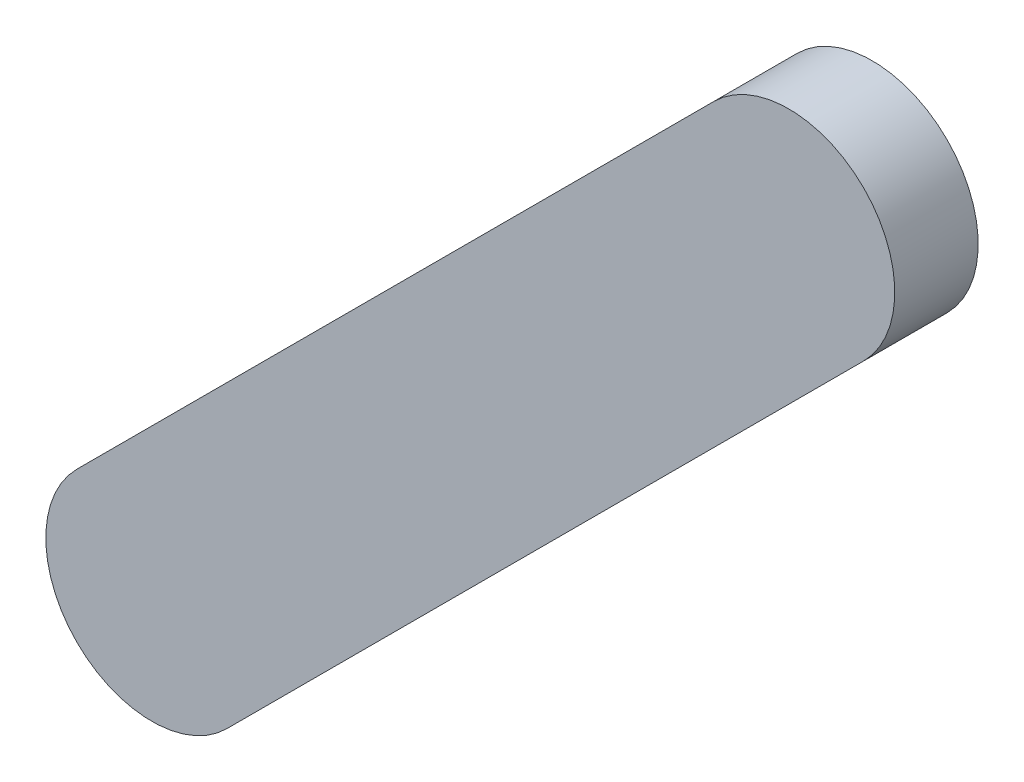
ISO-10303-21;
HEADER;
FILE_DESCRIPTION(('STEP AP214'),'2;1');
FILE_NAME('part.step','',(''),(''),'','','');
FILE_SCHEMA(('AUTOMOTIVE_DESIGN { 1 0 10303 214 1 1 1 1 }'));
ENDSEC;
DATA;
#1=APPLICATION_CONTEXT('core data for automotive mechanical design processes');
#2=APPLICATION_PROTOCOL_DEFINITION('international standard','automotive_design',2000,#1);
#3=PRODUCT_CONTEXT('',#1,'mechanical');
#4=PRODUCT('Part','Part','',(#3));
#5=PRODUCT_RELATED_PRODUCT_CATEGORY('part','',(#4));
#6=PRODUCT_DEFINITION_FORMATION('','',#4);
#7=PRODUCT_DEFINITION_CONTEXT('part definition',#1,'design');
#8=PRODUCT_DEFINITION('design','',#6,#7);
#9=PRODUCT_DEFINITION_SHAPE('','',#8);
#10=(LENGTH_UNIT() NAMED_UNIT(*) SI_UNIT(.MILLI.,.METRE.));
#11=(NAMED_UNIT(*) PLANE_ANGLE_UNIT() SI_UNIT($,.RADIAN.));
#12=(NAMED_UNIT(*) SI_UNIT($,.STERADIAN.) SOLID_ANGLE_UNIT());
#13=UNCERTAINTY_MEASURE_WITH_UNIT(LENGTH_MEASURE(1.E-05),#10,'distance_accuracy_value','');
#14=(GEOMETRIC_REPRESENTATION_CONTEXT(3) GLOBAL_UNCERTAINTY_ASSIGNED_CONTEXT((#13)) GLOBAL_UNIT_ASSIGNED_CONTEXT((#10,
#11,#12)) REPRESENTATION_CONTEXT('',''));
#15=CARTESIAN_POINT('',(0.,0.,0.));
#16=DIRECTION('',(0.,0.,1.));
#17=DIRECTION('',(1.,0.,0.));
#18=AXIS2_PLACEMENT_3D('',#15,#16,#17);
#19=CARTESIAN_POINT('',(138.98760874,88.2093994,0.));
#20=DIRECTION('',(-0.707106781186544,0.707106781186551,0.));
#21=DIRECTION('',(0.707106781186551,0.707106781186544,0.));
#22=AXIS2_PLACEMENT_3D('',#19,#20,#21);
#23=PLANE('',#22);
#24=DIRECTION('',(0.707106781186551,0.707106781186544,0.));
#25=VECTOR('',#24,1.);
#26=CARTESIAN_POINT('',(138.98760874,88.2093994,0.1999996));
#27=LINE('',#26,#25);
#28=CARTESIAN_POINT('',(138.98760874,88.2093994,0.1999996));
#29=VERTEX_POINT('',#28);
#30=CARTESIAN_POINT('',(140.5146034,89.73639406,0.1999996));
#31=VERTEX_POINT('',#30);
#32=EDGE_CURVE('E11',#29,#31,#27,.T.);
#33=ORIENTED_EDGE('',*,*,#32,.F.);
#34=DIRECTION('',(0.,0.,1.));
#35=VECTOR('',#34,1.);
#36=CARTESIAN_POINT('',(138.98760874,88.2093994,0.));
#37=LINE('',#36,#35);
#38=CARTESIAN_POINT('',(138.98760874,88.2093994,0.));
#39=VERTEX_POINT('',#38);
#40=EDGE_CURVE('E24',#39,#29,#37,.T.);
#41=ORIENTED_EDGE('',*,*,#40,.F.);
#42=DIRECTION('',(0.707106781186551,0.707106781186544,0.));
#43=VECTOR('',#42,1.);
#44=CARTESIAN_POINT('',(138.98760874,88.2093994,0.));
#45=LINE('',#44,#43);
#46=CARTESIAN_POINT('',(140.5146034,89.73639406,0.));
#47=VERTEX_POINT('',#46);
#48=EDGE_CURVE('E75',#39,#47,#45,.T.);
#49=ORIENTED_EDGE('',*,*,#48,.T.);
#50=DIRECTION('',(0.,0.,1.));
#51=VECTOR('',#50,1.);
#52=CARTESIAN_POINT('',(140.5146034,89.73639406,0.));
#53=LINE('',#52,#51);
#54=EDGE_CURVE('E37',#47,#31,#53,.T.);
#55=ORIENTED_EDGE('',*,*,#54,.T.);
#56=EDGE_LOOP('',(#33,#41,#49,#55));
#57=FACE_BOUND('',#56,.T.);
#58=ADVANCED_FACE('F17',(#57),#23,.F.);
#59=CARTESIAN_POINT('',(140.33499873,89.91599873,0.));
#60=DIRECTION('',(0.,0.,-1.));
#61=DIRECTION('',(0.707106781186548,-0.707106781186548,0.));
#62=AXIS2_PLACEMENT_3D('',#59,#60,#61);
#63=CYLINDRICAL_SURFACE('',#62,0.253999360179549);
#64=CARTESIAN_POINT('',(140.33499873,89.91599873,0.1999996));
#65=DIRECTION('',(0.,0.,1.));
#66=DIRECTION('',(0.707106781186548,-0.707106781186548,0.));
#67=AXIS2_PLACEMENT_3D('',#64,#65,#66);
#68=CIRCLE('',#67,0.253999360179549);
#69=CARTESIAN_POINT('',(140.15539406,90.0956034,0.1999996));
#70=VERTEX_POINT('',#69);
#71=EDGE_CURVE('E83',#31,#70,#68,.T.);
#72=ORIENTED_EDGE('',*,*,#71,.F.);
#73=ORIENTED_EDGE('',*,*,#54,.F.);
#74=CARTESIAN_POINT('',(140.33499873,89.91599873,0.));
#75=DIRECTION('',(0.,0.,1.));
#76=DIRECTION('',(0.707106781186548,-0.707106781186548,0.));
#77=AXIS2_PLACEMENT_3D('',#74,#75,#76);
#78=CIRCLE('',#77,0.253999360179549);
#79=CARTESIAN_POINT('',(140.15539406,90.0956034,0.));
#80=VERTEX_POINT('',#79);
#81=EDGE_CURVE('E81',#47,#80,#78,.T.);
#82=ORIENTED_EDGE('',*,*,#81,.T.);
#83=DIRECTION('',(0.,0.,1.));
#84=VECTOR('',#83,1.);
#85=CARTESIAN_POINT('',(140.15539406,90.0956034,0.));
#86=LINE('',#85,#84);
#87=EDGE_CURVE('E67',#80,#70,#86,.T.);
#88=ORIENTED_EDGE('',*,*,#87,.T.);
#89=EDGE_LOOP('',(#72,#73,#82,#88));
#90=FACE_BOUND('',#89,.T.);
#91=ADVANCED_FACE('F89',(#90),#63,.T.);
#92=CARTESIAN_POINT('',(140.15539406,90.0956034,0.));
#93=DIRECTION('',(0.707106781186551,-0.707106781186544,0.));
#94=DIRECTION('',(-0.707106781186544,-0.707106781186551,0.));
#95=AXIS2_PLACEMENT_3D('',#92,#93,#94);
#96=PLANE('',#95);
#97=DIRECTION('',(-0.707106781186544,-0.707106781186551,0.));
#98=VECTOR('',#97,1.);
#99=CARTESIAN_POINT('',(140.15539406,90.0956034,0.1999996));
#100=LINE('',#99,#98);
#101=CARTESIAN_POINT('',(138.6283994,88.56860874,0.1999996));
#102=VERTEX_POINT('',#101);
#103=EDGE_CURVE('E71',#70,#102,#100,.T.);
#104=ORIENTED_EDGE('',*,*,#103,.F.);
#105=ORIENTED_EDGE('',*,*,#87,.F.);
#106=DIRECTION('',(-0.707106781186544,-0.707106781186551,0.));
#107=VECTOR('',#106,1.);
#108=CARTESIAN_POINT('',(140.15539406,90.0956034,0.));
#109=LINE('',#108,#107);
#110=CARTESIAN_POINT('',(138.6283994,88.56860874,0.));
#111=VERTEX_POINT('',#110);
#112=EDGE_CURVE('E63',#80,#111,#109,.T.);
#113=ORIENTED_EDGE('',*,*,#112,.T.);
#114=DIRECTION('',(0.,0.,1.));
#115=VECTOR('',#114,1.);
#116=CARTESIAN_POINT('',(138.6283994,88.56860874,0.));
#117=LINE('',#116,#115);
#118=EDGE_CURVE('E53',#111,#102,#117,.T.);
#119=ORIENTED_EDGE('',*,*,#118,.T.);
#120=EDGE_LOOP('',(#104,#105,#113,#119));
#121=FACE_BOUND('',#120,.T.);
#122=ADVANCED_FACE('F66',(#121),#96,.F.);
#123=CARTESIAN_POINT('',(138.80800407,88.38900407,0.));
#124=DIRECTION('',(0.,0.,-1.));
#125=DIRECTION('',(-0.707106781186492,0.707106781186603,0.));
#126=AXIS2_PLACEMENT_3D('',#123,#124,#125);
#127=CYLINDRICAL_SURFACE('',#126,0.253999360179536);
#128=CARTESIAN_POINT('',(138.80800407,88.38900407,0.1999996));
#129=DIRECTION('',(0.,0.,1.));
#130=DIRECTION('',(-0.707106781186492,0.707106781186603,0.));
#131=AXIS2_PLACEMENT_3D('',#128,#129,#130);
#132=CIRCLE('',#131,0.253999360179536);
#133=EDGE_CURVE('E59',#102,#29,#132,.T.);
#134=ORIENTED_EDGE('',*,*,#133,.F.);
#135=ORIENTED_EDGE('',*,*,#118,.F.);
#136=CARTESIAN_POINT('',(138.80800407,88.38900407,0.));
#137=DIRECTION('',(0.,0.,1.));
#138=DIRECTION('',(-0.707106781186492,0.707106781186603,0.));
#139=AXIS2_PLACEMENT_3D('',#136,#137,#138);
#140=CIRCLE('',#139,0.253999360179536);
#141=EDGE_CURVE('E57',#111,#39,#140,.T.);
#142=ORIENTED_EDGE('',*,*,#141,.T.);
#143=ORIENTED_EDGE('',*,*,#40,.T.);
#144=EDGE_LOOP('',(#134,#135,#142,#143));
#145=FACE_BOUND('',#144,.T.);
#146=ADVANCED_FACE('F55',(#145),#127,.T.);
#147=CARTESIAN_POINT('',(138.98760874,88.2093994,0.));
#148=DIRECTION('',(0.,0.,-1.));
#149=DIRECTION('',(-1.,0.,0.));
#150=AXIS2_PLACEMENT_3D('',#147,#148,#149);
#151=PLANE('',#150);
#152=ORIENTED_EDGE('',*,*,#141,.F.);
#153=ORIENTED_EDGE('',*,*,#112,.F.);
#154=ORIENTED_EDGE('',*,*,#81,.F.);
#155=ORIENTED_EDGE('',*,*,#48,.F.);
#156=EDGE_LOOP('',(#152,#153,#154,#155));
#157=FACE_BOUND('',#156,.T.);
#158=ADVANCED_FACE('F74',(#157),#151,.T.);
#159=CARTESIAN_POINT('',(138.98760874,88.2093994,0.1999996));
#160=DIRECTION('',(0.,0.,-1.));
#161=DIRECTION('',(-1.,0.,0.));
#162=AXIS2_PLACEMENT_3D('',#159,#160,#161);
#163=PLANE('',#162);
#164=ORIENTED_EDGE('',*,*,#32,.T.);
#165=ORIENTED_EDGE('',*,*,#71,.T.);
#166=ORIENTED_EDGE('',*,*,#103,.T.);
#167=ORIENTED_EDGE('',*,*,#133,.T.);
#168=EDGE_LOOP('',(#164,#165,#166,#167));
#169=FACE_BOUND('',#168,.T.);
#170=ADVANCED_FACE('F91',(#169),#163,.F.);
#171=CLOSED_SHELL('',(#58,#91,#122,#146,#158,#170));
#172=MANIFOLD_SOLID_BREP('B1',#171);
#173=ADVANCED_BREP_SHAPE_REPRESENTATION('',(#18,#172),#14);
#174=SHAPE_DEFINITION_REPRESENTATION(#9,#173);
ENDSEC;
END-ISO-10303-21;
